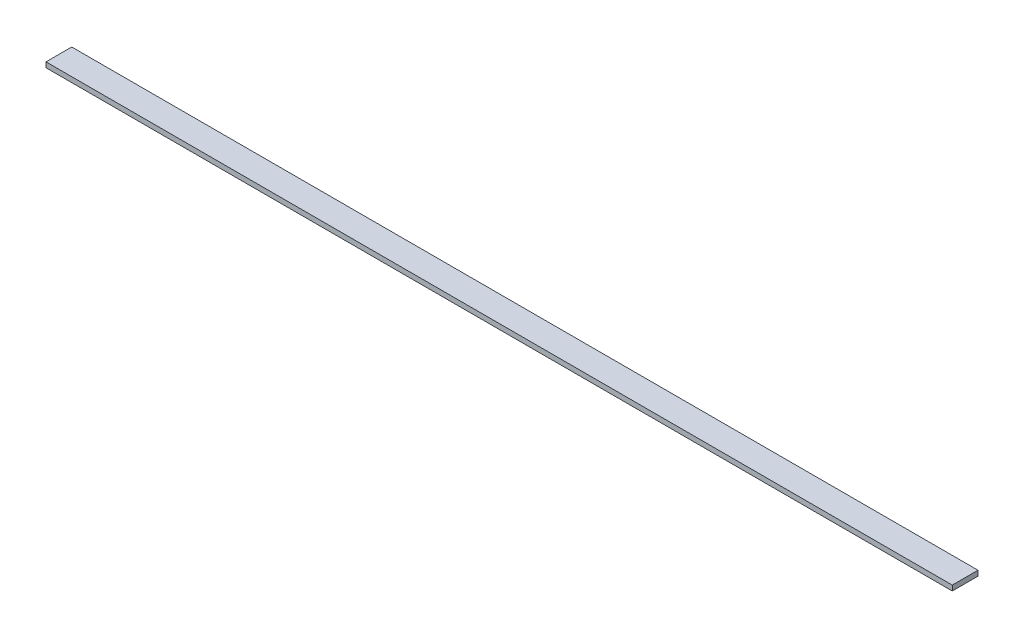
ISO-10303-21;
HEADER;
FILE_DESCRIPTION(('STEP AP214'),'2;1');
FILE_NAME('part.step','',(''),(''),'','','');
FILE_SCHEMA(('AUTOMOTIVE_DESIGN { 1 0 10303 214 1 1 1 1 }'));
ENDSEC;
DATA;
#1=APPLICATION_CONTEXT('core data for automotive mechanical design processes');
#2=APPLICATION_PROTOCOL_DEFINITION('international standard','automotive_design',2000,#1);
#3=PRODUCT_CONTEXT('',#1,'mechanical');
#4=PRODUCT('Part','Part','',(#3));
#5=PRODUCT_RELATED_PRODUCT_CATEGORY('part','',(#4));
#6=PRODUCT_DEFINITION_FORMATION('','',#4);
#7=PRODUCT_DEFINITION_CONTEXT('part definition',#1,'design');
#8=PRODUCT_DEFINITION('design','',#6,#7);
#9=PRODUCT_DEFINITION_SHAPE('','',#8);
#10=(LENGTH_UNIT() NAMED_UNIT(*) SI_UNIT(.MILLI.,.METRE.));
#11=(NAMED_UNIT(*) PLANE_ANGLE_UNIT() SI_UNIT($,.RADIAN.));
#12=(NAMED_UNIT(*) SI_UNIT($,.STERADIAN.) SOLID_ANGLE_UNIT());
#13=UNCERTAINTY_MEASURE_WITH_UNIT(LENGTH_MEASURE(1.E-05),#10,'distance_accuracy_value','');
#14=(GEOMETRIC_REPRESENTATION_CONTEXT(3) GLOBAL_UNCERTAINTY_ASSIGNED_CONTEXT((#13)) GLOBAL_UNIT_ASSIGNED_CONTEXT((#10,
#11,#12)) REPRESENTATION_CONTEXT('',''));
#15=CARTESIAN_POINT('',(0.,0.,0.));
#16=DIRECTION('',(0.,0.,1.));
#17=DIRECTION('',(1.,0.,0.));
#18=AXIS2_PLACEMENT_3D('',#15,#16,#17);
#19=CARTESIAN_POINT('',(-65.2784668144527,2.,-23.1059919665018));
#20=DIRECTION('',(1.,0.,0.));
#21=DIRECTION('',(0.,0.,-1.));
#22=AXIS2_PLACEMENT_3D('',#19,#20,#21);
#23=PLANE('',#22);
#24=DIRECTION('',(0.,0.,1.));
#25=VECTOR('',#24,1.);
#26=CARTESIAN_POINT('',(-65.2784668144527,0.,-23.1059919665018));
#27=LINE('',#26,#25);
#28=CARTESIAN_POINT('',(-65.2784668144527,0.,-23.1059919665018));
#29=VERTEX_POINT('',#28);
#30=CARTESIAN_POINT('',(-65.2784668144527,0.,-13.1059919665018));
#31=VERTEX_POINT('',#30);
#32=EDGE_CURVE('E98',#29,#31,#27,.T.);
#33=ORIENTED_EDGE('',*,*,#32,.T.);
#34=DIRECTION('',(0.,-1.,0.));
#35=VECTOR('',#34,1.);
#36=CARTESIAN_POINT('',(-65.2784668144527,2.,-13.1059919665018));
#37=LINE('',#36,#35);
#38=CARTESIAN_POINT('',(-65.2784668144527,2.,-13.1059919665018));
#39=VERTEX_POINT('',#38);
#40=EDGE_CURVE('E11',#39,#31,#37,.T.);
#41=ORIENTED_EDGE('',*,*,#40,.F.);
#42=DIRECTION('',(0.,0.,1.));
#43=VECTOR('',#42,1.);
#44=CARTESIAN_POINT('',(-65.2784668144527,2.,-23.1059919665018));
#45=LINE('',#44,#43);
#46=CARTESIAN_POINT('',(-65.2784668144527,2.,-23.1059919665018));
#47=VERTEX_POINT('',#46);
#48=EDGE_CURVE('E86',#47,#39,#45,.T.);
#49=ORIENTED_EDGE('',*,*,#48,.F.);
#50=DIRECTION('',(0.,-1.,0.));
#51=VECTOR('',#50,1.);
#52=CARTESIAN_POINT('',(-65.2784668144527,2.,-23.1059919665018));
#53=LINE('',#52,#51);
#54=EDGE_CURVE('E94',#47,#29,#53,.T.);
#55=ORIENTED_EDGE('',*,*,#54,.T.);
#56=EDGE_LOOP('',(#33,#41,#49,#55));
#57=FACE_BOUND('',#56,.T.);
#58=ADVANCED_FACE('F35',(#57),#23,.F.);
#59=CARTESIAN_POINT('',(-65.2784668144527,2.,-13.1059919665018));
#60=DIRECTION('',(0.,0.,-1.));
#61=DIRECTION('',(-1.,0.,0.));
#62=AXIS2_PLACEMENT_3D('',#59,#60,#61);
#63=PLANE('',#62);
#64=DIRECTION('',(1.,0.,0.));
#65=VECTOR('',#64,1.);
#66=CARTESIAN_POINT('',(-65.2784668144527,0.,-13.1059919665018));
#67=LINE('',#66,#65);
#68=CARTESIAN_POINT('',(286.931533185547,0.,-13.1059919665018));
#69=VERTEX_POINT('',#68);
#70=EDGE_CURVE('E90',#31,#69,#67,.T.);
#71=ORIENTED_EDGE('',*,*,#70,.T.);
#72=DIRECTION('',(0.,-1.,0.));
#73=VECTOR('',#72,1.);
#74=CARTESIAN_POINT('',(286.931533185547,2.,-13.1059919665018));
#75=LINE('',#74,#73);
#76=CARTESIAN_POINT('',(286.931533185547,2.,-13.1059919665018));
#77=VERTEX_POINT('',#76);
#78=EDGE_CURVE('E43',#77,#69,#75,.T.);
#79=ORIENTED_EDGE('',*,*,#78,.F.);
#80=DIRECTION('',(1.,0.,0.));
#81=VECTOR('',#80,1.);
#82=CARTESIAN_POINT('',(-65.2784668144527,2.,-13.1059919665018));
#83=LINE('',#82,#81);
#84=EDGE_CURVE('E81',#39,#77,#83,.T.);
#85=ORIENTED_EDGE('',*,*,#84,.F.);
#86=ORIENTED_EDGE('',*,*,#40,.T.);
#87=EDGE_LOOP('',(#71,#79,#85,#86));
#88=FACE_BOUND('',#87,.T.);
#89=ADVANCED_FACE('F89',(#88),#63,.F.);
#90=CARTESIAN_POINT('',(286.931533185547,2.,-23.1059919665018));
#91=DIRECTION('',(-1.,0.,0.));
#92=DIRECTION('',(0.,0.,1.));
#93=AXIS2_PLACEMENT_3D('',#90,#91,#92);
#94=PLANE('',#93);
#95=DIRECTION('',(0.,0.,-1.));
#96=VECTOR('',#95,1.);
#97=CARTESIAN_POINT('',(286.931533185547,0.,-23.1059919665018));
#98=LINE('',#97,#96);
#99=CARTESIAN_POINT('',(286.931533185547,0.,-23.1059919665018));
#100=VERTEX_POINT('',#99);
#101=EDGE_CURVE('E68',#69,#100,#98,.T.);
#102=ORIENTED_EDGE('',*,*,#101,.T.);
#103=DIRECTION('',(0.,-1.,0.));
#104=VECTOR('',#103,1.);
#105=CARTESIAN_POINT('',(286.931533185547,2.,-23.1059919665018));
#106=LINE('',#105,#104);
#107=CARTESIAN_POINT('',(286.931533185547,2.,-23.1059919665018));
#108=VERTEX_POINT('',#107);
#109=EDGE_CURVE('E91',#108,#100,#106,.T.);
#110=ORIENTED_EDGE('',*,*,#109,.F.);
#111=DIRECTION('',(0.,0.,-1.));
#112=VECTOR('',#111,1.);
#113=CARTESIAN_POINT('',(286.931533185547,2.,-23.1059919665018));
#114=LINE('',#113,#112);
#115=EDGE_CURVE('E84',#77,#108,#114,.T.);
#116=ORIENTED_EDGE('',*,*,#115,.F.);
#117=ORIENTED_EDGE('',*,*,#78,.T.);
#118=EDGE_LOOP('',(#102,#110,#116,#117));
#119=FACE_BOUND('',#118,.T.);
#120=ADVANCED_FACE('F92',(#119),#94,.F.);
#121=CARTESIAN_POINT('',(-65.2784668144527,2.,-23.1059919665018));
#122=DIRECTION('',(0.,0.,1.));
#123=DIRECTION('',(1.,0.,0.));
#124=AXIS2_PLACEMENT_3D('',#121,#122,#123);
#125=PLANE('',#124);
#126=DIRECTION('',(-1.,0.,0.));
#127=VECTOR('',#126,1.);
#128=CARTESIAN_POINT('',(-65.2784668144527,0.,-23.1059919665018));
#129=LINE('',#128,#127);
#130=EDGE_CURVE('E74',#100,#29,#129,.T.);
#131=ORIENTED_EDGE('',*,*,#130,.T.);
#132=ORIENTED_EDGE('',*,*,#54,.F.);
#133=DIRECTION('',(-1.,0.,0.));
#134=VECTOR('',#133,1.);
#135=CARTESIAN_POINT('',(-65.2784668144527,2.,-23.1059919665018));
#136=LINE('',#135,#134);
#137=EDGE_CURVE('E51',#108,#47,#136,.T.);
#138=ORIENTED_EDGE('',*,*,#137,.F.);
#139=ORIENTED_EDGE('',*,*,#109,.T.);
#140=EDGE_LOOP('',(#131,#132,#138,#139));
#141=FACE_BOUND('',#140,.T.);
#142=ADVANCED_FACE('F105',(#141),#125,.F.);
#143=CARTESIAN_POINT('',(0.,2.,0.));
#144=DIRECTION('',(0.,1.,0.));
#145=DIRECTION('',(0.,0.,1.));
#146=AXIS2_PLACEMENT_3D('',#143,#144,#145);
#147=PLANE('',#146);
#148=ORIENTED_EDGE('',*,*,#48,.T.);
#149=ORIENTED_EDGE('',*,*,#84,.T.);
#150=ORIENTED_EDGE('',*,*,#115,.T.);
#151=ORIENTED_EDGE('',*,*,#137,.T.);
#152=EDGE_LOOP('',(#148,#149,#150,#151));
#153=FACE_BOUND('',#152,.T.);
#154=ADVANCED_FACE('F82',(#153),#147,.T.);
#155=CARTESIAN_POINT('',(0.,0.,0.));
#156=DIRECTION('',(0.,1.,0.));
#157=DIRECTION('',(0.,0.,1.));
#158=AXIS2_PLACEMENT_3D('',#155,#156,#157);
#159=PLANE('',#158);
#160=ORIENTED_EDGE('',*,*,#32,.F.);
#161=ORIENTED_EDGE('',*,*,#130,.F.);
#162=ORIENTED_EDGE('',*,*,#101,.F.);
#163=ORIENTED_EDGE('',*,*,#70,.F.);
#164=EDGE_LOOP('',(#160,#161,#162,#163));
#165=FACE_BOUND('',#164,.T.);
#166=ADVANCED_FACE('F108',(#165),#159,.F.);
#167=CLOSED_SHELL('',(#58,#89,#120,#142,#154,#166));
#168=MANIFOLD_SOLID_BREP('B2',#167);
#169=ADVANCED_BREP_SHAPE_REPRESENTATION('',(#18,#168),#14);
#170=SHAPE_DEFINITION_REPRESENTATION(#9,#169);
ENDSEC;
END-ISO-10303-21;
